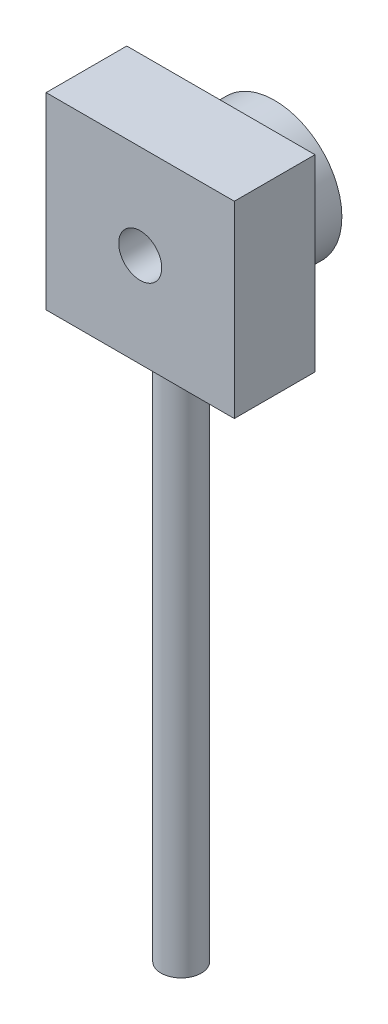
ISO-10303-21;
HEADER;
FILE_DESCRIPTION(('STEP AP214'),'2;1');
FILE_NAME('part.step','',(''),(''),'','','');
FILE_SCHEMA(('AUTOMOTIVE_DESIGN { 1 0 10303 214 1 1 1 1 }'));
ENDSEC;
DATA;
#1=APPLICATION_CONTEXT('core data for automotive mechanical design processes');
#2=APPLICATION_PROTOCOL_DEFINITION('international standard','automotive_design',2000,#1);
#3=PRODUCT_CONTEXT('',#1,'mechanical');
#4=PRODUCT('Part','Part','',(#3));
#5=PRODUCT_RELATED_PRODUCT_CATEGORY('part','',(#4));
#6=PRODUCT_DEFINITION_FORMATION('','',#4);
#7=PRODUCT_DEFINITION_CONTEXT('part definition',#1,'design');
#8=PRODUCT_DEFINITION('design','',#6,#7);
#9=PRODUCT_DEFINITION_SHAPE('','',#8);
#10=(LENGTH_UNIT() NAMED_UNIT(*) SI_UNIT(.MILLI.,.METRE.));
#11=(NAMED_UNIT(*) PLANE_ANGLE_UNIT() SI_UNIT($,.RADIAN.));
#12=(NAMED_UNIT(*) SI_UNIT($,.STERADIAN.) SOLID_ANGLE_UNIT());
#13=UNCERTAINTY_MEASURE_WITH_UNIT(LENGTH_MEASURE(1.E-05),#10,'distance_accuracy_value','');
#14=(GEOMETRIC_REPRESENTATION_CONTEXT(3) GLOBAL_UNCERTAINTY_ASSIGNED_CONTEXT((#13)) GLOBAL_UNIT_ASSIGNED_CONTEXT((#10,
#11,#12)) REPRESENTATION_CONTEXT('',''));
#15=CARTESIAN_POINT('',(0.,0.,0.));
#16=DIRECTION('',(0.,0.,1.));
#17=DIRECTION('',(1.,0.,0.));
#18=AXIS2_PLACEMENT_3D('',#15,#16,#17);
#19=CARTESIAN_POINT('',(0.,-235.,14.7620987816482));
#20=DIRECTION('',(0.,1.,0.));
#21=DIRECTION('',(1.,0.,0.));
#22=AXIS2_PLACEMENT_3D('',#19,#20,#21);
#23=PLANE('',#22);
#24=CARTESIAN_POINT('',(0.,-235.,14.7620987816482));
#25=DIRECTION('',(0.,1.,0.));
#26=DIRECTION('',(0.,0.,-1.));
#27=AXIS2_PLACEMENT_3D('',#24,#25,#26);
#28=CIRCLE('',#27,7.5);
#29=CARTESIAN_POINT('',(0.,-235.,7.26209878164821));
#30=VERTEX_POINT('',#29);
#31=EDGE_CURVE('E10',#30,#30,#28,.T.);
#32=ORIENTED_EDGE('',*,*,#31,.F.);
#33=EDGE_LOOP('',(#32));
#34=FACE_BOUND('',#33,.T.);
#35=ADVANCED_FACE('F16',(#34),#23,.F.);
#36=CARTESIAN_POINT('',(0.,-235.,14.7620987816482));
#37=DIRECTION('',(0.,1.,0.));
#38=DIRECTION('',(0.,0.,1.));
#39=AXIS2_PLACEMENT_3D('',#36,#37,#38);
#40=CYLINDRICAL_SURFACE('',#39,7.5);
#41=CARTESIAN_POINT('',(0.,-35.,14.7620987816482));
#42=DIRECTION('',(0.,1.,0.));
#43=DIRECTION('',(0.,0.,-1.));
#44=AXIS2_PLACEMENT_3D('',#41,#42,#43);
#45=CIRCLE('',#44,7.5);
#46=CARTESIAN_POINT('',(0.,-35.,7.26209878164821));
#47=VERTEX_POINT('',#46);
#48=EDGE_CURVE('E20',#47,#47,#45,.T.);
#49=ORIENTED_EDGE('',*,*,#48,.F.);
#50=EDGE_LOOP('',(#49));
#51=FACE_BOUND('',#50,.T.);
#52=ORIENTED_EDGE('',*,*,#31,.T.);
#53=EDGE_LOOP('',(#52));
#54=FACE_BOUND('',#53,.T.);
#55=ADVANCED_FACE('F18',(#51,#54),#40,.T.);
#56=CARTESIAN_POINT('',(0.,0.,124.33899449941));
#57=DIRECTION('',(0.,0.,-1.));
#58=DIRECTION('',(-1.,0.,0.));
#59=AXIS2_PLACEMENT_3D('',#56,#57,#58);
#60=CYLINDRICAL_SURFACE('',#59,8.);
#61=CARTESIAN_POINT('',(0.,0.,-20.));
#62=DIRECTION('',(0.,0.,1.));
#63=DIRECTION('',(1.,0.,0.));
#64=AXIS2_PLACEMENT_3D('',#61,#62,#63);
#65=CIRCLE('',#64,8.);
#66=CARTESIAN_POINT('',(8.,0.,-20.));
#67=VERTEX_POINT('',#66);
#68=EDGE_CURVE('E27',#67,#67,#65,.T.);
#69=ORIENTED_EDGE('',*,*,#68,.F.);
#70=EDGE_LOOP('',(#69));
#71=FACE_BOUND('',#70,.T.);
#72=CARTESIAN_POINT('',(0.,0.,30.));
#73=DIRECTION('',(0.,0.,-1.));
#74=DIRECTION('',(1.,0.,0.));
#75=AXIS2_PLACEMENT_3D('',#72,#73,#74);
#76=CIRCLE('',#75,8.);
#77=CARTESIAN_POINT('',(8.,0.,30.));
#78=VERTEX_POINT('',#77);
#79=EDGE_CURVE('E126',#78,#78,#76,.T.);
#80=ORIENTED_EDGE('',*,*,#79,.F.);
#81=EDGE_LOOP('',(#80));
#82=FACE_BOUND('',#81,.T.);
#83=ADVANCED_FACE('F168',(#71,#82),#60,.F.);
#84=CARTESIAN_POINT('',(0.,0.,-20.));
#85=DIRECTION('',(0.,0.,1.));
#86=DIRECTION('',(1.,0.,0.));
#87=AXIS2_PLACEMENT_3D('',#84,#85,#86);
#88=PLANE('',#87);
#89=CARTESIAN_POINT('',(0.,0.,-20.));
#90=DIRECTION('',(0.,0.,1.));
#91=DIRECTION('',(1.,0.,0.));
#92=AXIS2_PLACEMENT_3D('',#89,#90,#91);
#93=CIRCLE('',#92,25.);
#94=CARTESIAN_POINT('',(25.,0.,-20.));
#95=VERTEX_POINT('',#94);
#96=EDGE_CURVE('E139',#95,#95,#93,.T.);
#97=ORIENTED_EDGE('',*,*,#96,.F.);
#98=EDGE_LOOP('',(#97));
#99=FACE_BOUND('',#98,.T.);
#100=ORIENTED_EDGE('',*,*,#68,.T.);
#101=EDGE_LOOP('',(#100));
#102=FACE_BOUND('',#101,.T.);
#103=ADVANCED_FACE('F165',(#99,#102),#88,.F.);
#104=CARTESIAN_POINT('',(0.,0.,-20.));
#105=DIRECTION('',(0.,0.,1.));
#106=DIRECTION('',(1.,0.,0.));
#107=AXIS2_PLACEMENT_3D('',#104,#105,#106);
#108=CYLINDRICAL_SURFACE('',#107,25.);
#109=CARTESIAN_POINT('',(0.,0.,0.));
#110=DIRECTION('',(0.,0.,1.));
#111=DIRECTION('',(1.,0.,0.));
#112=AXIS2_PLACEMENT_3D('',#109,#110,#111);
#113=CIRCLE('',#112,25.);
#114=CARTESIAN_POINT('',(25.,0.,0.));
#115=VERTEX_POINT('',#114);
#116=EDGE_CURVE('E129',#115,#115,#113,.T.);
#117=ORIENTED_EDGE('',*,*,#116,.F.);
#118=EDGE_LOOP('',(#117));
#119=FACE_BOUND('',#118,.T.);
#120=ORIENTED_EDGE('',*,*,#96,.T.);
#121=EDGE_LOOP('',(#120));
#122=FACE_BOUND('',#121,.T.);
#123=ADVANCED_FACE('F162',(#119,#122),#108,.T.);
#124=CARTESIAN_POINT('',(0.,0.,0.));
#125=DIRECTION('',(0.,0.,1.));
#126=DIRECTION('',(1.,0.,0.));
#127=AXIS2_PLACEMENT_3D('',#124,#125,#126);
#128=PLANE('',#127);
#129=DIRECTION('',(-1.,0.,0.));
#130=VECTOR('',#129,1.);
#131=CARTESIAN_POINT('',(35.,35.,0.));
#132=LINE('',#131,#130);
#133=CARTESIAN_POINT('',(35.,35.,0.));
#134=VERTEX_POINT('',#133);
#135=CARTESIAN_POINT('',(-35.,35.,0.));
#136=VERTEX_POINT('',#135);
#137=EDGE_CURVE('E95',#134,#136,#132,.T.);
#138=ORIENTED_EDGE('',*,*,#137,.F.);
#139=DIRECTION('',(0.,1.,0.));
#140=VECTOR('',#139,1.);
#141=CARTESIAN_POINT('',(35.,-35.,0.));
#142=LINE('',#141,#140);
#143=CARTESIAN_POINT('',(35.,-35.,0.));
#144=VERTEX_POINT('',#143);
#145=EDGE_CURVE('E62',#144,#134,#142,.T.);
#146=ORIENTED_EDGE('',*,*,#145,.F.);
#147=DIRECTION('',(1.,0.,0.));
#148=VECTOR('',#147,1.);
#149=CARTESIAN_POINT('',(-35.,-35.,0.));
#150=LINE('',#149,#148);
#151=CARTESIAN_POINT('',(-35.,-35.,0.));
#152=VERTEX_POINT('',#151);
#153=EDGE_CURVE('E97',#152,#144,#150,.T.);
#154=ORIENTED_EDGE('',*,*,#153,.F.);
#155=DIRECTION('',(0.,-1.,0.));
#156=VECTOR('',#155,1.);
#157=CARTESIAN_POINT('',(-35.,35.,0.));
#158=LINE('',#157,#156);
#159=EDGE_CURVE('E90',#136,#152,#158,.T.);
#160=ORIENTED_EDGE('',*,*,#159,.F.);
#161=EDGE_LOOP('',(#138,#146,#154,#160));
#162=FACE_BOUND('',#161,.T.);
#163=ORIENTED_EDGE('',*,*,#116,.T.);
#164=EDGE_LOOP('',(#163));
#165=FACE_BOUND('',#164,.T.);
#166=ADVANCED_FACE('F92',(#162,#165),#128,.F.);
#167=CARTESIAN_POINT('',(0.,0.,30.));
#168=DIRECTION('',(0.,0.,1.));
#169=DIRECTION('',(1.,0.,0.));
#170=AXIS2_PLACEMENT_3D('',#167,#168,#169);
#171=PLANE('',#170);
#172=DIRECTION('',(-1.,0.,0.));
#173=VECTOR('',#172,1.);
#174=CARTESIAN_POINT('',(35.,35.,30.));
#175=LINE('',#174,#173);
#176=CARTESIAN_POINT('',(35.,35.,30.));
#177=VERTEX_POINT('',#176);
#178=CARTESIAN_POINT('',(-35.,35.,30.));
#179=VERTEX_POINT('',#178);
#180=EDGE_CURVE('E114',#177,#179,#175,.T.);
#181=ORIENTED_EDGE('',*,*,#180,.T.);
#182=DIRECTION('',(0.,-1.,0.));
#183=VECTOR('',#182,1.);
#184=CARTESIAN_POINT('',(-35.,35.,30.));
#185=LINE('',#184,#183);
#186=CARTESIAN_POINT('',(-35.,-35.,30.));
#187=VERTEX_POINT('',#186);
#188=EDGE_CURVE('E109',#179,#187,#185,.T.);
#189=ORIENTED_EDGE('',*,*,#188,.T.);
#190=DIRECTION('',(1.,0.,0.));
#191=VECTOR('',#190,1.);
#192=CARTESIAN_POINT('',(-35.,-35.,30.));
#193=LINE('',#192,#191);
#194=CARTESIAN_POINT('',(35.,-35.,30.));
#195=VERTEX_POINT('',#194);
#196=EDGE_CURVE('E140',#187,#195,#193,.T.);
#197=ORIENTED_EDGE('',*,*,#196,.T.);
#198=DIRECTION('',(0.,1.,0.));
#199=VECTOR('',#198,1.);
#200=CARTESIAN_POINT('',(35.,-35.,30.));
#201=LINE('',#200,#199);
#202=EDGE_CURVE('E74',#195,#177,#201,.T.);
#203=ORIENTED_EDGE('',*,*,#202,.T.);
#204=EDGE_LOOP('',(#181,#189,#197,#203));
#205=FACE_BOUND('',#204,.T.);
#206=ORIENTED_EDGE('',*,*,#79,.T.);
#207=EDGE_LOOP('',(#206));
#208=FACE_BOUND('',#207,.T.);
#209=ADVANCED_FACE('F177',(#205,#208),#171,.T.);
#210=CARTESIAN_POINT('',(35.,-35.,30.));
#211=DIRECTION('',(-1.,0.,0.));
#212=DIRECTION('',(0.,0.,1.));
#213=AXIS2_PLACEMENT_3D('',#210,#211,#212);
#214=PLANE('',#213);
#215=ORIENTED_EDGE('',*,*,#145,.T.);
#216=DIRECTION('',(0.,0.,-1.));
#217=VECTOR('',#216,1.);
#218=CARTESIAN_POINT('',(35.,35.,30.));
#219=LINE('',#218,#217);
#220=EDGE_CURVE('E103',#177,#134,#219,.T.);
#221=ORIENTED_EDGE('',*,*,#220,.F.);
#222=ORIENTED_EDGE('',*,*,#202,.F.);
#223=DIRECTION('',(0.,0.,-1.));
#224=VECTOR('',#223,1.);
#225=CARTESIAN_POINT('',(35.,-35.,30.));
#226=LINE('',#225,#224);
#227=EDGE_CURVE('E132',#195,#144,#226,.T.);
#228=ORIENTED_EDGE('',*,*,#227,.T.);
#229=EDGE_LOOP('',(#215,#221,#222,#228));
#230=FACE_BOUND('',#229,.T.);
#231=ADVANCED_FACE('F179',(#230),#214,.F.);
#232=CARTESIAN_POINT('',(-35.,-35.,30.));
#233=DIRECTION('',(0.,1.,0.));
#234=DIRECTION('',(1.,0.,0.));
#235=AXIS2_PLACEMENT_3D('',#232,#233,#234);
#236=PLANE('',#235);
#237=ORIENTED_EDGE('',*,*,#153,.T.);
#238=ORIENTED_EDGE('',*,*,#227,.F.);
#239=ORIENTED_EDGE('',*,*,#196,.F.);
#240=DIRECTION('',(0.,0.,-1.));
#241=VECTOR('',#240,1.);
#242=CARTESIAN_POINT('',(-35.,-35.,30.));
#243=LINE('',#242,#241);
#244=EDGE_CURVE('E102',#187,#152,#243,.T.);
#245=ORIENTED_EDGE('',*,*,#244,.T.);
#246=EDGE_LOOP('',(#237,#238,#239,#245));
#247=FACE_BOUND('',#246,.T.);
#248=ORIENTED_EDGE('',*,*,#48,.T.);
#249=EDGE_LOOP('',(#248));
#250=FACE_BOUND('',#249,.T.);
#251=ADVANCED_FACE('F186',(#247,#250),#236,.F.);
#252=CARTESIAN_POINT('',(-35.,35.,30.));
#253=DIRECTION('',(1.,0.,0.));
#254=DIRECTION('',(0.,1.,0.));
#255=AXIS2_PLACEMENT_3D('',#252,#253,#254);
#256=PLANE('',#255);
#257=ORIENTED_EDGE('',*,*,#159,.T.);
#258=ORIENTED_EDGE('',*,*,#244,.F.);
#259=ORIENTED_EDGE('',*,*,#188,.F.);
#260=DIRECTION('',(0.,0.,-1.));
#261=VECTOR('',#260,1.);
#262=CARTESIAN_POINT('',(-35.,35.,30.));
#263=LINE('',#262,#261);
#264=EDGE_CURVE('E106',#179,#136,#263,.T.);
#265=ORIENTED_EDGE('',*,*,#264,.T.);
#266=EDGE_LOOP('',(#257,#258,#259,#265));
#267=FACE_BOUND('',#266,.T.);
#268=ADVANCED_FACE('F107',(#267),#256,.F.);
#269=CARTESIAN_POINT('',(35.,35.,30.));
#270=DIRECTION('',(0.,-1.,0.));
#271=DIRECTION('',(0.,0.,-1.));
#272=AXIS2_PLACEMENT_3D('',#269,#270,#271);
#273=PLANE('',#272);
#274=ORIENTED_EDGE('',*,*,#137,.T.);
#275=ORIENTED_EDGE('',*,*,#264,.F.);
#276=ORIENTED_EDGE('',*,*,#180,.F.);
#277=ORIENTED_EDGE('',*,*,#220,.T.);
#278=EDGE_LOOP('',(#274,#275,#276,#277));
#279=FACE_BOUND('',#278,.T.);
#280=ADVANCED_FACE('F117',(#279),#273,.F.);
#281=CLOSED_SHELL('',(#35,#55,#83,#103,#123,#166,#209,#231,#251,#268,#280));
#282=MANIFOLD_SOLID_BREP('B1',#281);
#283=ADVANCED_BREP_SHAPE_REPRESENTATION('',(#18,#282),#14);
#284=SHAPE_DEFINITION_REPRESENTATION(#9,#283);
ENDSEC;
END-ISO-10303-21;
